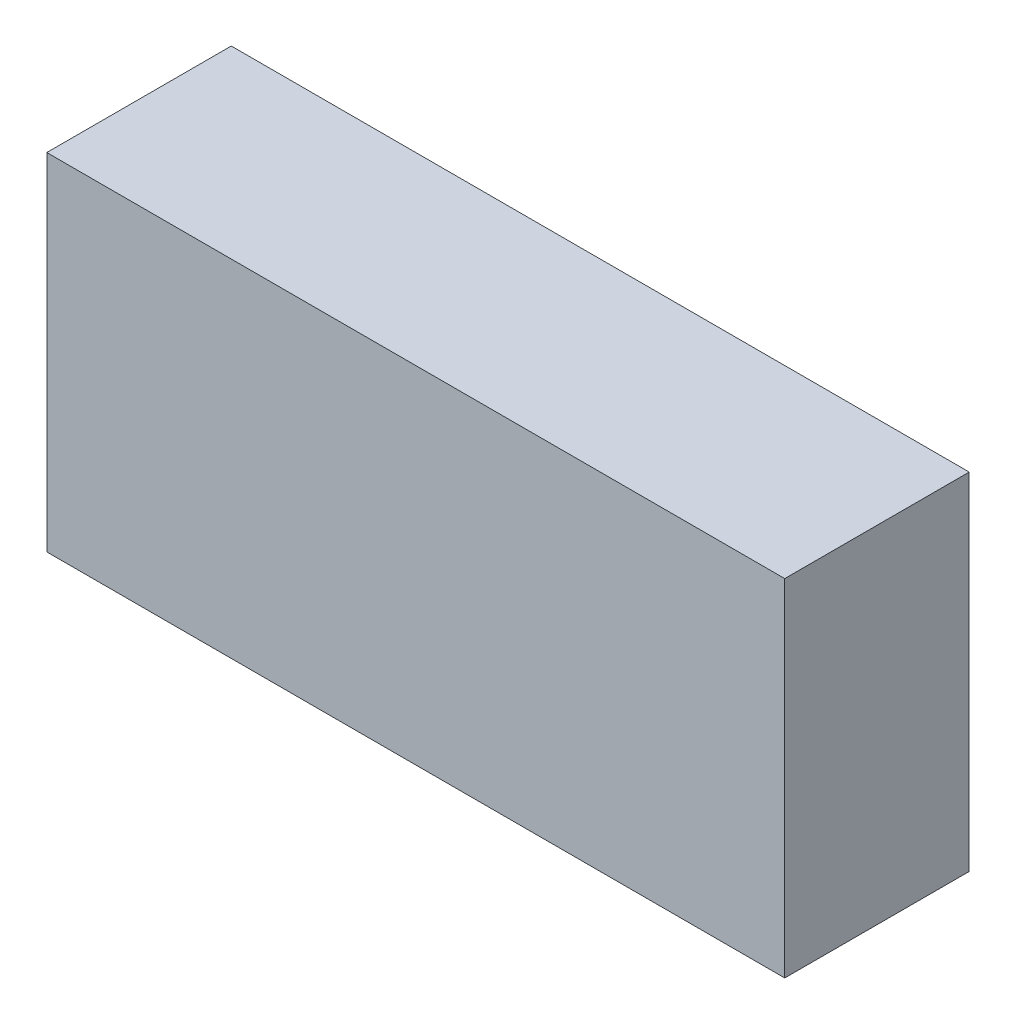
ISO-10303-21;
HEADER;
FILE_DESCRIPTION(('STEP AP214'),'2;1');
FILE_NAME('part.step','',(''),(''),'','','');
FILE_SCHEMA(('AUTOMOTIVE_DESIGN { 1 0 10303 214 1 1 1 1 }'));
ENDSEC;
DATA;
#1=APPLICATION_CONTEXT('core data for automotive mechanical design processes');
#2=APPLICATION_PROTOCOL_DEFINITION('international standard','automotive_design',2000,#1);
#3=PRODUCT_CONTEXT('',#1,'mechanical');
#4=PRODUCT('Part','Part','',(#3));
#5=PRODUCT_RELATED_PRODUCT_CATEGORY('part','',(#4));
#6=PRODUCT_DEFINITION_FORMATION('','',#4);
#7=PRODUCT_DEFINITION_CONTEXT('part definition',#1,'design');
#8=PRODUCT_DEFINITION('design','',#6,#7);
#9=PRODUCT_DEFINITION_SHAPE('','',#8);
#10=(LENGTH_UNIT() NAMED_UNIT(*) SI_UNIT(.MILLI.,.METRE.));
#11=(NAMED_UNIT(*) PLANE_ANGLE_UNIT() SI_UNIT($,.RADIAN.));
#12=(NAMED_UNIT(*) SI_UNIT($,.STERADIAN.) SOLID_ANGLE_UNIT());
#13=UNCERTAINTY_MEASURE_WITH_UNIT(LENGTH_MEASURE(1.E-05),#10,'distance_accuracy_value','');
#14=(GEOMETRIC_REPRESENTATION_CONTEXT(3) GLOBAL_UNCERTAINTY_ASSIGNED_CONTEXT((#13)) GLOBAL_UNIT_ASSIGNED_CONTEXT((#10,
#11,#12)) REPRESENTATION_CONTEXT('',''));
#15=CARTESIAN_POINT('',(0.,0.,0.));
#16=DIRECTION('',(0.,0.,1.));
#17=DIRECTION('',(1.,0.,0.));
#18=AXIS2_PLACEMENT_3D('',#15,#16,#17);
#19=CARTESIAN_POINT('',(-32.,-15.,-16.));
#20=DIRECTION('',(-1.,0.,0.));
#21=DIRECTION('',(0.,0.,1.));
#22=AXIS2_PLACEMENT_3D('',#19,#20,#21);
#23=PLANE('',#22);
#24=DIRECTION('',(0.,-1.,0.));
#25=VECTOR('',#24,1.);
#26=CARTESIAN_POINT('',(-32.,-15.,0.));
#27=LINE('',#26,#25);
#28=CARTESIAN_POINT('',(-32.,15.,0.));
#29=VERTEX_POINT('',#28);
#30=CARTESIAN_POINT('',(-32.,-15.,0.));
#31=VERTEX_POINT('',#30);
#32=EDGE_CURVE('E99',#29,#31,#27,.T.);
#33=ORIENTED_EDGE('',*,*,#32,.F.);
#34=DIRECTION('',(0.,0.,1.));
#35=VECTOR('',#34,1.);
#36=CARTESIAN_POINT('',(-32.,15.,-16.));
#37=LINE('',#36,#35);
#38=CARTESIAN_POINT('',(-32.,15.,-16.));
#39=VERTEX_POINT('',#38);
#40=EDGE_CURVE('E11',#39,#29,#37,.T.);
#41=ORIENTED_EDGE('',*,*,#40,.F.);
#42=DIRECTION('',(0.,-1.,0.));
#43=VECTOR('',#42,1.);
#44=CARTESIAN_POINT('',(-32.,-15.,-16.));
#45=LINE('',#44,#43);
#46=CARTESIAN_POINT('',(-32.,-15.,-16.));
#47=VERTEX_POINT('',#46);
#48=EDGE_CURVE('E93',#39,#47,#45,.T.);
#49=ORIENTED_EDGE('',*,*,#48,.T.);
#50=DIRECTION('',(0.,0.,1.));
#51=VECTOR('',#50,1.);
#52=CARTESIAN_POINT('',(-32.,-15.,-16.));
#53=LINE('',#52,#51);
#54=EDGE_CURVE('E38',#47,#31,#53,.T.);
#55=ORIENTED_EDGE('',*,*,#54,.T.);
#56=EDGE_LOOP('',(#33,#41,#49,#55));
#57=FACE_BOUND('',#56,.T.);
#58=ADVANCED_FACE('F35',(#57),#23,.T.);
#59=CARTESIAN_POINT('',(32.,15.,-16.));
#60=DIRECTION('',(0.,1.,0.));
#61=DIRECTION('',(-1.,0.,0.));
#62=AXIS2_PLACEMENT_3D('',#59,#60,#61);
#63=PLANE('',#62);
#64=DIRECTION('',(-1.,0.,0.));
#65=VECTOR('',#64,1.);
#66=CARTESIAN_POINT('',(32.,15.,0.));
#67=LINE('',#66,#65);
#68=CARTESIAN_POINT('',(32.,15.,0.));
#69=VERTEX_POINT('',#68);
#70=EDGE_CURVE('E95',#69,#29,#67,.T.);
#71=ORIENTED_EDGE('',*,*,#70,.F.);
#72=DIRECTION('',(0.,0.,1.));
#73=VECTOR('',#72,1.);
#74=CARTESIAN_POINT('',(32.,15.,-16.));
#75=LINE('',#74,#73);
#76=CARTESIAN_POINT('',(32.,15.,-16.));
#77=VERTEX_POINT('',#76);
#78=EDGE_CURVE('E44',#77,#69,#75,.T.);
#79=ORIENTED_EDGE('',*,*,#78,.F.);
#80=DIRECTION('',(-1.,0.,0.));
#81=VECTOR('',#80,1.);
#82=CARTESIAN_POINT('',(32.,15.,-16.));
#83=LINE('',#82,#81);
#84=EDGE_CURVE('E90',#77,#39,#83,.T.);
#85=ORIENTED_EDGE('',*,*,#84,.T.);
#86=ORIENTED_EDGE('',*,*,#40,.T.);
#87=EDGE_LOOP('',(#71,#79,#85,#86));
#88=FACE_BOUND('',#87,.T.);
#89=ADVANCED_FACE('F109',(#88),#63,.T.);
#90=CARTESIAN_POINT('',(32.,-15.,-16.));
#91=DIRECTION('',(1.,0.,0.));
#92=DIRECTION('',(0.,0.,-1.));
#93=AXIS2_PLACEMENT_3D('',#90,#91,#92);
#94=PLANE('',#93);
#95=DIRECTION('',(0.,1.,0.));
#96=VECTOR('',#95,1.);
#97=CARTESIAN_POINT('',(32.,-15.,0.));
#98=LINE('',#97,#96);
#99=CARTESIAN_POINT('',(32.,-15.,0.));
#100=VERTEX_POINT('',#99);
#101=EDGE_CURVE('E85',#100,#69,#98,.T.);
#102=ORIENTED_EDGE('',*,*,#101,.F.);
#103=DIRECTION('',(0.,0.,1.));
#104=VECTOR('',#103,1.);
#105=CARTESIAN_POINT('',(32.,-15.,-16.));
#106=LINE('',#105,#104);
#107=CARTESIAN_POINT('',(32.,-15.,-16.));
#108=VERTEX_POINT('',#107);
#109=EDGE_CURVE('E80',#108,#100,#106,.T.);
#110=ORIENTED_EDGE('',*,*,#109,.F.);
#111=DIRECTION('',(0.,1.,0.));
#112=VECTOR('',#111,1.);
#113=CARTESIAN_POINT('',(32.,-15.,-16.));
#114=LINE('',#113,#112);
#115=EDGE_CURVE('E83',#108,#77,#114,.T.);
#116=ORIENTED_EDGE('',*,*,#115,.T.);
#117=ORIENTED_EDGE('',*,*,#78,.T.);
#118=EDGE_LOOP('',(#102,#110,#116,#117));
#119=FACE_BOUND('',#118,.T.);
#120=ADVANCED_FACE('F82',(#119),#94,.T.);
#121=CARTESIAN_POINT('',(32.,-15.,-16.));
#122=DIRECTION('',(0.,-1.,0.));
#123=DIRECTION('',(1.,0.,0.));
#124=AXIS2_PLACEMENT_3D('',#121,#122,#123);
#125=PLANE('',#124);
#126=DIRECTION('',(1.,0.,0.));
#127=VECTOR('',#126,1.);
#128=CARTESIAN_POINT('',(32.,-15.,0.));
#129=LINE('',#128,#127);
#130=EDGE_CURVE('E102',#31,#100,#129,.T.);
#131=ORIENTED_EDGE('',*,*,#130,.F.);
#132=ORIENTED_EDGE('',*,*,#54,.F.);
#133=DIRECTION('',(1.,0.,0.));
#134=VECTOR('',#133,1.);
#135=CARTESIAN_POINT('',(32.,-15.,-16.));
#136=LINE('',#135,#134);
#137=EDGE_CURVE('E89',#47,#108,#136,.T.);
#138=ORIENTED_EDGE('',*,*,#137,.T.);
#139=ORIENTED_EDGE('',*,*,#109,.T.);
#140=EDGE_LOOP('',(#131,#132,#138,#139));
#141=FACE_BOUND('',#140,.T.);
#142=ADVANCED_FACE('F92',(#141),#125,.T.);
#143=CARTESIAN_POINT('',(0.,0.,-16.));
#144=DIRECTION('',(0.,0.,1.));
#145=DIRECTION('',(1.,0.,0.));
#146=AXIS2_PLACEMENT_3D('',#143,#144,#145);
#147=PLANE('',#146);
#148=ORIENTED_EDGE('',*,*,#48,.F.);
#149=ORIENTED_EDGE('',*,*,#84,.F.);
#150=ORIENTED_EDGE('',*,*,#115,.F.);
#151=ORIENTED_EDGE('',*,*,#137,.F.);
#152=EDGE_LOOP('',(#148,#149,#150,#151));
#153=FACE_BOUND('',#152,.T.);
#154=ADVANCED_FACE('F88',(#153),#147,.F.);
#155=CARTESIAN_POINT('',(0.,0.,0.));
#156=DIRECTION('',(0.,0.,1.));
#157=DIRECTION('',(1.,0.,0.));
#158=AXIS2_PLACEMENT_3D('',#155,#156,#157);
#159=PLANE('',#158);
#160=ORIENTED_EDGE('',*,*,#32,.T.);
#161=ORIENTED_EDGE('',*,*,#130,.T.);
#162=ORIENTED_EDGE('',*,*,#101,.T.);
#163=ORIENTED_EDGE('',*,*,#70,.T.);
#164=EDGE_LOOP('',(#160,#161,#162,#163));
#165=FACE_BOUND('',#164,.T.);
#166=ADVANCED_FACE('F108',(#165),#159,.T.);
#167=CLOSED_SHELL('',(#58,#89,#120,#142,#154,#166));
#168=MANIFOLD_SOLID_BREP('B2',#167);
#169=ADVANCED_BREP_SHAPE_REPRESENTATION('',(#18,#168),#14);
#170=SHAPE_DEFINITION_REPRESENTATION(#9,#169);
ENDSEC;
END-ISO-10303-21;
